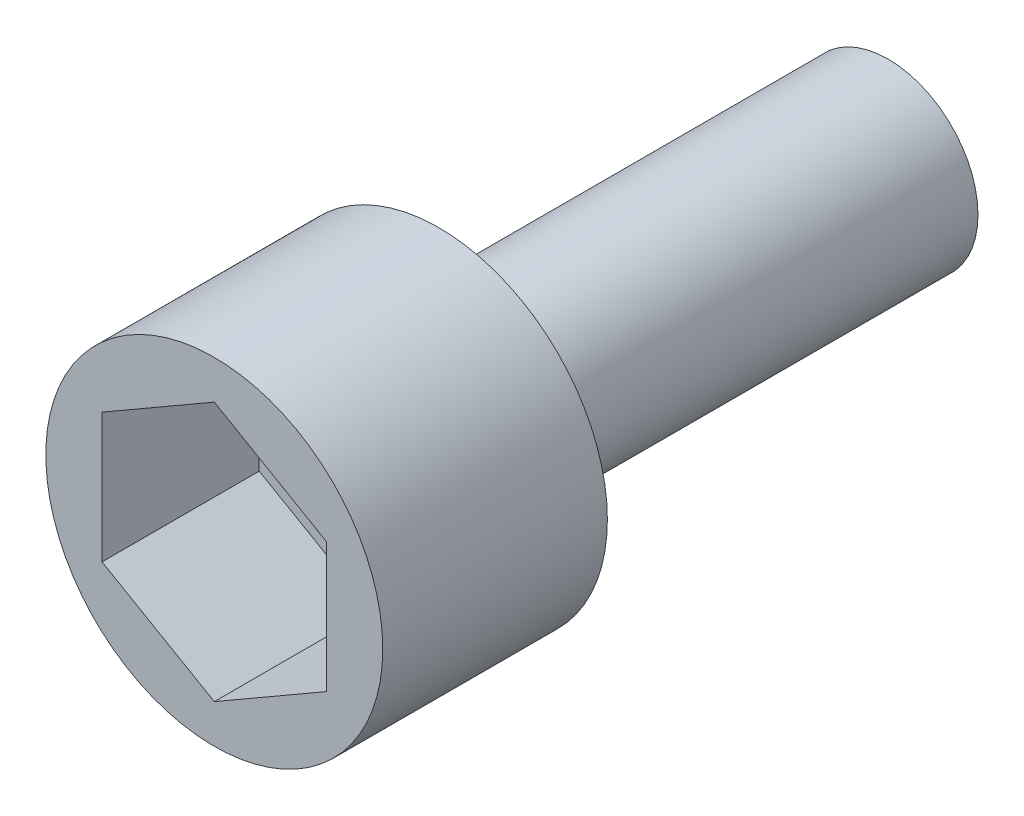
ISO-10303-21;
HEADER;
FILE_DESCRIPTION(('STEP AP214'),'2;1');
FILE_NAME('part.step','',(''),(''),'','','');
FILE_SCHEMA(('AUTOMOTIVE_DESIGN { 1 0 10303 214 1 1 1 1 }'));
ENDSEC;
DATA;
#1=APPLICATION_CONTEXT('core data for automotive mechanical design processes');
#2=APPLICATION_PROTOCOL_DEFINITION('international standard','automotive_design',2000,#1);
#3=PRODUCT_CONTEXT('',#1,'mechanical');
#4=PRODUCT('Part','Part','',(#3));
#5=PRODUCT_RELATED_PRODUCT_CATEGORY('part','',(#4));
#6=PRODUCT_DEFINITION_FORMATION('','',#4);
#7=PRODUCT_DEFINITION_CONTEXT('part definition',#1,'design');
#8=PRODUCT_DEFINITION('design','',#6,#7);
#9=PRODUCT_DEFINITION_SHAPE('','',#8);
#10=(LENGTH_UNIT() NAMED_UNIT(*) SI_UNIT(.MILLI.,.METRE.));
#11=(NAMED_UNIT(*) PLANE_ANGLE_UNIT() SI_UNIT($,.RADIAN.));
#12=(NAMED_UNIT(*) SI_UNIT($,.STERADIAN.) SOLID_ANGLE_UNIT());
#13=UNCERTAINTY_MEASURE_WITH_UNIT(LENGTH_MEASURE(1.E-05),#10,'distance_accuracy_value','');
#14=(GEOMETRIC_REPRESENTATION_CONTEXT(3) GLOBAL_UNCERTAINTY_ASSIGNED_CONTEXT((#13)) GLOBAL_UNIT_ASSIGNED_CONTEXT((#10,
#11,#12)) REPRESENTATION_CONTEXT('',''));
#15=CARTESIAN_POINT('',(0.,0.,0.));
#16=DIRECTION('',(0.,0.,1.));
#17=DIRECTION('',(1.,0.,0.));
#18=AXIS2_PLACEMENT_3D('',#15,#16,#17);
#19=CARTESIAN_POINT('',(0.,0.,-10.));
#20=DIRECTION('',(0.,0.,1.));
#21=DIRECTION('',(1.,0.,0.));
#22=AXIS2_PLACEMENT_3D('',#19,#20,#21);
#23=CYLINDRICAL_SURFACE('',#22,7.5);
#24=CARTESIAN_POINT('',(0.,0.,-10.));
#25=DIRECTION('',(0.,0.,1.));
#26=DIRECTION('',(1.,0.,0.));
#27=AXIS2_PLACEMENT_3D('',#24,#25,#26);
#28=CIRCLE('',#27,7.5);
#29=CARTESIAN_POINT('',(7.5,0.,-10.));
#30=VERTEX_POINT('',#29);
#31=EDGE_CURVE('E11',#30,#30,#28,.T.);
#32=ORIENTED_EDGE('',*,*,#31,.T.);
#33=EDGE_LOOP('',(#32));
#34=FACE_BOUND('',#33,.T.);
#35=CARTESIAN_POINT('',(0.,0.,0.));
#36=DIRECTION('',(0.,0.,1.));
#37=DIRECTION('',(1.,0.,0.));
#38=AXIS2_PLACEMENT_3D('',#35,#36,#37);
#39=CIRCLE('',#38,7.5);
#40=CARTESIAN_POINT('',(7.5,0.,0.));
#41=VERTEX_POINT('',#40);
#42=EDGE_CURVE('E42',#41,#41,#39,.T.);
#43=ORIENTED_EDGE('',*,*,#42,.F.);
#44=EDGE_LOOP('',(#43));
#45=FACE_BOUND('',#44,.T.);
#46=ADVANCED_FACE('F39',(#34,#45),#23,.T.);
#47=CARTESIAN_POINT('',(0.,0.,-10.));
#48=DIRECTION('',(0.,0.,1.));
#49=DIRECTION('',(1.,0.,0.));
#50=AXIS2_PLACEMENT_3D('',#47,#48,#49);
#51=PLANE('',#50);
#52=CARTESIAN_POINT('',(0.,0.,-10.));
#53=DIRECTION('',(0.,0.,1.));
#54=DIRECTION('',(1.,0.,0.));
#55=AXIS2_PLACEMENT_3D('',#52,#53,#54);
#56=CIRCLE('',#55,4.);
#57=CARTESIAN_POINT('',(4.,0.,-10.));
#58=VERTEX_POINT('',#57);
#59=EDGE_CURVE('E148',#58,#58,#56,.T.);
#60=ORIENTED_EDGE('',*,*,#59,.T.);
#61=EDGE_LOOP('',(#60));
#62=FACE_BOUND('',#61,.T.);
#63=ORIENTED_EDGE('',*,*,#31,.F.);
#64=EDGE_LOOP('',(#63));
#65=FACE_BOUND('',#64,.T.);
#66=ADVANCED_FACE('F158',(#62,#65),#51,.F.);
#67=CARTESIAN_POINT('',(0.,0.,0.));
#68=DIRECTION('',(0.,0.,1.));
#69=DIRECTION('',(1.,0.,0.));
#70=AXIS2_PLACEMENT_3D('',#67,#68,#69);
#71=PLANE('',#70);
#72=DIRECTION('',(0.,1.,0.));
#73=VECTOR('',#72,1.);
#74=CARTESIAN_POINT('',(5.,-2.88675134594813,0.));
#75=LINE('',#74,#73);
#76=CARTESIAN_POINT('',(5.,-2.88675134594813,0.));
#77=VERTEX_POINT('',#76);
#78=CARTESIAN_POINT('',(5.,2.88675134594813,0.));
#79=VERTEX_POINT('',#78);
#80=EDGE_CURVE('E53',#77,#79,#75,.T.);
#81=ORIENTED_EDGE('',*,*,#80,.F.);
#82=DIRECTION('',(0.866025403784439,0.5,0.));
#83=VECTOR('',#82,1.);
#84=CARTESIAN_POINT('',(0.,-5.77350269189626,0.));
#85=LINE('',#84,#83);
#86=CARTESIAN_POINT('',(0.,-5.77350269189626,0.));
#87=VERTEX_POINT('',#86);
#88=EDGE_CURVE('E136',#87,#77,#85,.T.);
#89=ORIENTED_EDGE('',*,*,#88,.F.);
#90=DIRECTION('',(0.866025403784439,-0.5,0.));
#91=VECTOR('',#90,1.);
#92=CARTESIAN_POINT('',(-5.,-2.88675134594813,0.));
#93=LINE('',#92,#91);
#94=CARTESIAN_POINT('',(-5.,-2.88675134594813,0.));
#95=VERTEX_POINT('',#94);
#96=EDGE_CURVE('E134',#95,#87,#93,.T.);
#97=ORIENTED_EDGE('',*,*,#96,.F.);
#98=DIRECTION('',(0.,-1.,0.));
#99=VECTOR('',#98,1.);
#100=CARTESIAN_POINT('',(-5.,2.88675134594813,0.));
#101=LINE('',#100,#99);
#102=CARTESIAN_POINT('',(-5.,2.88675134594813,0.));
#103=VERTEX_POINT('',#102);
#104=EDGE_CURVE('E101',#103,#95,#101,.T.);
#105=ORIENTED_EDGE('',*,*,#104,.F.);
#106=DIRECTION('',(-0.866025403784439,-0.5,0.));
#107=VECTOR('',#106,1.);
#108=CARTESIAN_POINT('',(0.,5.77350269189626,0.));
#109=LINE('',#108,#107);
#110=CARTESIAN_POINT('',(0.,5.77350269189626,0.));
#111=VERTEX_POINT('',#110);
#112=EDGE_CURVE('E130',#111,#103,#109,.T.);
#113=ORIENTED_EDGE('',*,*,#112,.F.);
#114=DIRECTION('',(-0.866025403784439,0.5,0.));
#115=VECTOR('',#114,1.);
#116=CARTESIAN_POINT('',(5.,2.88675134594813,0.));
#117=LINE('',#116,#115);
#118=EDGE_CURVE('E127',#79,#111,#117,.T.);
#119=ORIENTED_EDGE('',*,*,#118,.F.);
#120=EDGE_LOOP('',(#81,#89,#97,#105,#113,#119));
#121=FACE_BOUND('',#120,.T.);
#122=ORIENTED_EDGE('',*,*,#42,.T.);
#123=EDGE_LOOP('',(#122));
#124=FACE_BOUND('',#123,.T.);
#125=ADVANCED_FACE('F155',(#121,#124),#71,.T.);
#126=CARTESIAN_POINT('',(0.,0.,-30.));
#127=DIRECTION('',(0.,0.,1.));
#128=DIRECTION('',(1.,0.,0.));
#129=AXIS2_PLACEMENT_3D('',#126,#127,#128);
#130=CYLINDRICAL_SURFACE('',#129,4.);
#131=CARTESIAN_POINT('',(0.,0.,-30.));
#132=DIRECTION('',(0.,0.,1.));
#133=DIRECTION('',(1.,0.,0.));
#134=AXIS2_PLACEMENT_3D('',#131,#132,#133);
#135=CIRCLE('',#134,4.);
#136=CARTESIAN_POINT('',(4.,0.,-30.));
#137=VERTEX_POINT('',#136);
#138=EDGE_CURVE('E140',#137,#137,#135,.T.);
#139=ORIENTED_EDGE('',*,*,#138,.T.);
#140=EDGE_LOOP('',(#139));
#141=FACE_BOUND('',#140,.T.);
#142=ORIENTED_EDGE('',*,*,#59,.F.);
#143=EDGE_LOOP('',(#142));
#144=FACE_BOUND('',#143,.T.);
#145=ADVANCED_FACE('F170',(#141,#144),#130,.T.);
#146=CARTESIAN_POINT('',(0.,0.,-30.));
#147=DIRECTION('',(0.,0.,1.));
#148=DIRECTION('',(1.,0.,0.));
#149=AXIS2_PLACEMENT_3D('',#146,#147,#148);
#150=PLANE('',#149);
#151=ORIENTED_EDGE('',*,*,#138,.F.);
#152=EDGE_LOOP('',(#151));
#153=FACE_BOUND('',#152,.T.);
#154=ADVANCED_FACE('F174',(#153),#150,.F.);
#155=CARTESIAN_POINT('',(5.,-2.88675134594813,-7.));
#156=DIRECTION('',(1.,0.,0.));
#157=DIRECTION('',(0.,0.,-1.));
#158=AXIS2_PLACEMENT_3D('',#155,#156,#157);
#159=PLANE('',#158);
#160=ORIENTED_EDGE('',*,*,#80,.T.);
#161=DIRECTION('',(0.,0.,1.));
#162=VECTOR('',#161,1.);
#163=CARTESIAN_POINT('',(5.,2.88675134594813,-7.));
#164=LINE('',#163,#162);
#165=CARTESIAN_POINT('',(5.,2.88675134594813,-7.));
#166=VERTEX_POINT('',#165);
#167=EDGE_CURVE('E83',#166,#79,#164,.T.);
#168=ORIENTED_EDGE('',*,*,#167,.F.);
#169=DIRECTION('',(0.,1.,0.));
#170=VECTOR('',#169,1.);
#171=CARTESIAN_POINT('',(5.,-2.88675134594813,-7.));
#172=LINE('',#171,#170);
#173=CARTESIAN_POINT('',(5.,-2.88675134594813,-7.));
#174=VERTEX_POINT('',#173);
#175=EDGE_CURVE('E138',#174,#166,#172,.T.);
#176=ORIENTED_EDGE('',*,*,#175,.F.);
#177=DIRECTION('',(0.,0.,1.));
#178=VECTOR('',#177,1.);
#179=CARTESIAN_POINT('',(5.,-2.88675134594813,-7.));
#180=LINE('',#179,#178);
#181=EDGE_CURVE('E61',#174,#77,#180,.T.);
#182=ORIENTED_EDGE('',*,*,#181,.T.);
#183=EDGE_LOOP('',(#160,#168,#176,#182));
#184=FACE_BOUND('',#183,.T.);
#185=ADVANCED_FACE('F178',(#184),#159,.F.);
#186=CARTESIAN_POINT('',(0.,-5.77350269189626,-7.));
#187=DIRECTION('',(0.5,-0.866025403784439,0.));
#188=DIRECTION('',(0.866025403784439,0.5,0.));
#189=AXIS2_PLACEMENT_3D('',#186,#187,#188);
#190=PLANE('',#189);
#191=ORIENTED_EDGE('',*,*,#88,.T.);
#192=ORIENTED_EDGE('',*,*,#181,.F.);
#193=DIRECTION('',(0.866025403784439,0.5,0.));
#194=VECTOR('',#193,1.);
#195=CARTESIAN_POINT('',(0.,-5.77350269189626,-7.));
#196=LINE('',#195,#194);
#197=CARTESIAN_POINT('',(0.,-5.77350269189626,-7.));
#198=VERTEX_POINT('',#197);
#199=EDGE_CURVE('E113',#198,#174,#196,.T.);
#200=ORIENTED_EDGE('',*,*,#199,.F.);
#201=DIRECTION('',(0.,0.,1.));
#202=VECTOR('',#201,1.);
#203=CARTESIAN_POINT('',(0.,-5.77350269189626,-7.));
#204=LINE('',#203,#202);
#205=EDGE_CURVE('E105',#198,#87,#204,.T.);
#206=ORIENTED_EDGE('',*,*,#205,.T.);
#207=EDGE_LOOP('',(#191,#192,#200,#206));
#208=FACE_BOUND('',#207,.T.);
#209=ADVANCED_FACE('F182',(#208),#190,.F.);
#210=CARTESIAN_POINT('',(-5.,-2.88675134594813,-7.));
#211=DIRECTION('',(-0.5,-0.866025403784439,0.));
#212=DIRECTION('',(0.866025403784439,-0.5,0.));
#213=AXIS2_PLACEMENT_3D('',#210,#211,#212);
#214=PLANE('',#213);
#215=ORIENTED_EDGE('',*,*,#96,.T.);
#216=ORIENTED_EDGE('',*,*,#205,.F.);
#217=DIRECTION('',(0.866025403784439,-0.5,0.));
#218=VECTOR('',#217,1.);
#219=CARTESIAN_POINT('',(-5.,-2.88675134594813,-7.));
#220=LINE('',#219,#218);
#221=CARTESIAN_POINT('',(-5.,-2.88675134594813,-7.));
#222=VERTEX_POINT('',#221);
#223=EDGE_CURVE('E109',#222,#198,#220,.T.);
#224=ORIENTED_EDGE('',*,*,#223,.F.);
#225=DIRECTION('',(0.,0.,1.));
#226=VECTOR('',#225,1.);
#227=CARTESIAN_POINT('',(-5.,-2.88675134594813,-7.));
#228=LINE('',#227,#226);
#229=EDGE_CURVE('E94',#222,#95,#228,.T.);
#230=ORIENTED_EDGE('',*,*,#229,.T.);
#231=EDGE_LOOP('',(#215,#216,#224,#230));
#232=FACE_BOUND('',#231,.T.);
#233=ADVANCED_FACE('F110',(#232),#214,.F.);
#234=CARTESIAN_POINT('',(-5.,2.88675134594813,-7.));
#235=DIRECTION('',(-1.,0.,0.));
#236=DIRECTION('',(0.,0.,1.));
#237=AXIS2_PLACEMENT_3D('',#234,#235,#236);
#238=PLANE('',#237);
#239=ORIENTED_EDGE('',*,*,#104,.T.);
#240=ORIENTED_EDGE('',*,*,#229,.F.);
#241=DIRECTION('',(0.,-1.,0.));
#242=VECTOR('',#241,1.);
#243=CARTESIAN_POINT('',(-5.,2.88675134594813,-7.));
#244=LINE('',#243,#242);
#245=CARTESIAN_POINT('',(-5.,2.88675134594813,-7.));
#246=VERTEX_POINT('',#245);
#247=EDGE_CURVE('E98',#246,#222,#244,.T.);
#248=ORIENTED_EDGE('',*,*,#247,.F.);
#249=DIRECTION('',(0.,0.,1.));
#250=VECTOR('',#249,1.);
#251=CARTESIAN_POINT('',(-5.,2.88675134594813,-7.));
#252=LINE('',#251,#250);
#253=EDGE_CURVE('E106',#246,#103,#252,.T.);
#254=ORIENTED_EDGE('',*,*,#253,.T.);
#255=EDGE_LOOP('',(#239,#240,#248,#254));
#256=FACE_BOUND('',#255,.T.);
#257=ADVANCED_FACE('F96',(#256),#238,.F.);
#258=CARTESIAN_POINT('',(0.,5.77350269189626,-7.));
#259=DIRECTION('',(-0.5,0.866025403784439,0.));
#260=DIRECTION('',(-0.866025403784439,-0.5,0.));
#261=AXIS2_PLACEMENT_3D('',#258,#259,#260);
#262=PLANE('',#261);
#263=ORIENTED_EDGE('',*,*,#112,.T.);
#264=ORIENTED_EDGE('',*,*,#253,.F.);
#265=DIRECTION('',(-0.866025403784439,-0.5,0.));
#266=VECTOR('',#265,1.);
#267=CARTESIAN_POINT('',(0.,5.77350269189626,-7.));
#268=LINE('',#267,#266);
#269=CARTESIAN_POINT('',(0.,5.77350269189626,-7.));
#270=VERTEX_POINT('',#269);
#271=EDGE_CURVE('E119',#270,#246,#268,.T.);
#272=ORIENTED_EDGE('',*,*,#271,.F.);
#273=DIRECTION('',(0.,0.,1.));
#274=VECTOR('',#273,1.);
#275=CARTESIAN_POINT('',(0.,5.77350269189626,-7.));
#276=LINE('',#275,#274);
#277=EDGE_CURVE('E143',#270,#111,#276,.T.);
#278=ORIENTED_EDGE('',*,*,#277,.T.);
#279=EDGE_LOOP('',(#263,#264,#272,#278));
#280=FACE_BOUND('',#279,.T.);
#281=ADVANCED_FACE('F186',(#280),#262,.F.);
#282=CARTESIAN_POINT('',(5.,2.88675134594813,-7.));
#283=DIRECTION('',(0.5,0.866025403784439,0.));
#284=DIRECTION('',(-0.866025403784439,0.5,0.));
#285=AXIS2_PLACEMENT_3D('',#282,#283,#284);
#286=PLANE('',#285);
#287=ORIENTED_EDGE('',*,*,#118,.T.);
#288=ORIENTED_EDGE('',*,*,#277,.F.);
#289=DIRECTION('',(-0.866025403784439,0.5,0.));
#290=VECTOR('',#289,1.);
#291=CARTESIAN_POINT('',(5.,2.88675134594813,-7.));
#292=LINE('',#291,#290);
#293=EDGE_CURVE('E121',#166,#270,#292,.T.);
#294=ORIENTED_EDGE('',*,*,#293,.F.);
#295=ORIENTED_EDGE('',*,*,#167,.T.);
#296=EDGE_LOOP('',(#287,#288,#294,#295));
#297=FACE_BOUND('',#296,.T.);
#298=ADVANCED_FACE('F183',(#297),#286,.F.);
#299=CARTESIAN_POINT('',(0.,0.,-7.));
#300=DIRECTION('',(0.,0.,1.));
#301=DIRECTION('',(1.,0.,0.));
#302=AXIS2_PLACEMENT_3D('',#299,#300,#301);
#303=PLANE('',#302);
#304=ORIENTED_EDGE('',*,*,#175,.T.);
#305=ORIENTED_EDGE('',*,*,#293,.T.);
#306=ORIENTED_EDGE('',*,*,#271,.T.);
#307=ORIENTED_EDGE('',*,*,#247,.T.);
#308=ORIENTED_EDGE('',*,*,#223,.T.);
#309=ORIENTED_EDGE('',*,*,#199,.T.);
#310=EDGE_LOOP('',(#304,#305,#306,#307,#308,#309));
#311=FACE_BOUND('',#310,.T.);
#312=ADVANCED_FACE('F116',(#311),#303,.T.);
#313=CLOSED_SHELL('',(#46,#66,#125,#145,#154,#185,#209,#233,#257,#281,#298,#312));
#314=MANIFOLD_SOLID_BREP('B2',#313);
#315=ADVANCED_BREP_SHAPE_REPRESENTATION('',(#18,#314),#14);
#316=SHAPE_DEFINITION_REPRESENTATION(#9,#315);
ENDSEC;
END-ISO-10303-21;
